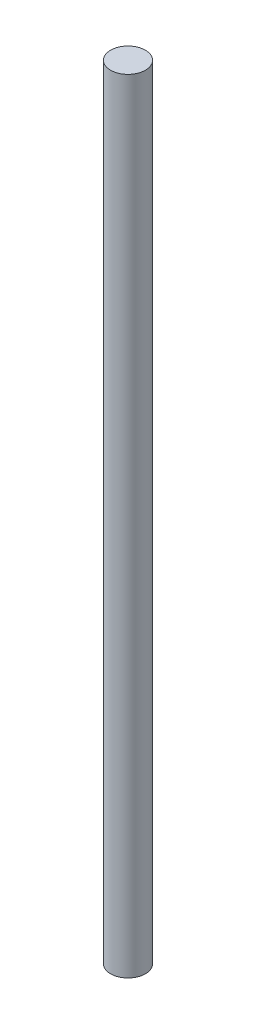
ISO-10303-21;
HEADER;
FILE_DESCRIPTION(('STEP AP214'),'2;1');
FILE_NAME('part.step','',(''),(''),'','','');
FILE_SCHEMA(('AUTOMOTIVE_DESIGN { 1 0 10303 214 1 1 1 1 }'));
ENDSEC;
DATA;
#1=APPLICATION_CONTEXT('core data for automotive mechanical design processes');
#2=APPLICATION_PROTOCOL_DEFINITION('international standard','automotive_design',2000,#1);
#3=PRODUCT_CONTEXT('',#1,'mechanical');
#4=PRODUCT('Part','Part','',(#3));
#5=PRODUCT_RELATED_PRODUCT_CATEGORY('part','',(#4));
#6=PRODUCT_DEFINITION_FORMATION('','',#4);
#7=PRODUCT_DEFINITION_CONTEXT('part definition',#1,'design');
#8=PRODUCT_DEFINITION('design','',#6,#7);
#9=PRODUCT_DEFINITION_SHAPE('','',#8);
#10=(LENGTH_UNIT() NAMED_UNIT(*) SI_UNIT(.MILLI.,.METRE.));
#11=(NAMED_UNIT(*) PLANE_ANGLE_UNIT() SI_UNIT($,.RADIAN.));
#12=(NAMED_UNIT(*) SI_UNIT($,.STERADIAN.) SOLID_ANGLE_UNIT());
#13=UNCERTAINTY_MEASURE_WITH_UNIT(LENGTH_MEASURE(1.E-05),#10,'distance_accuracy_value','');
#14=(GEOMETRIC_REPRESENTATION_CONTEXT(3) GLOBAL_UNCERTAINTY_ASSIGNED_CONTEXT((#13)) GLOBAL_UNIT_ASSIGNED_CONTEXT((#10,
#11,#12)) REPRESENTATION_CONTEXT('',''));
#15=CARTESIAN_POINT('',(0.,0.,0.));
#16=DIRECTION('',(0.,0.,1.));
#17=DIRECTION('',(1.,0.,0.));
#18=AXIS2_PLACEMENT_3D('',#15,#16,#17);
#19=CARTESIAN_POINT('',(0.,4.5,0.));
#20=DIRECTION('',(0.,-1.,0.));
#21=DIRECTION('',(0.,0.,-1.));
#22=AXIS2_PLACEMENT_3D('',#19,#20,#21);
#23=CYLINDRICAL_SURFACE('',#22,0.1);
#24=CARTESIAN_POINT('',(0.,4.5,0.));
#25=DIRECTION('',(0.,1.,0.));
#26=DIRECTION('',(0.,0.,1.));
#27=AXIS2_PLACEMENT_3D('',#24,#25,#26);
#28=CIRCLE('',#27,0.1);
#29=CARTESIAN_POINT('',(0.,4.5,0.1));
#30=VERTEX_POINT('',#29);
#31=EDGE_CURVE('E10',#30,#30,#28,.T.);
#32=ORIENTED_EDGE('',*,*,#31,.F.);
#33=EDGE_LOOP('',(#32));
#34=FACE_BOUND('',#33,.T.);
#35=CARTESIAN_POINT('',(0.,0.,0.));
#36=DIRECTION('',(0.,1.,0.));
#37=DIRECTION('',(0.,0.,1.));
#38=AXIS2_PLACEMENT_3D('',#35,#36,#37);
#39=CIRCLE('',#38,0.1);
#40=CARTESIAN_POINT('',(0.,0.,0.1));
#41=VERTEX_POINT('',#40);
#42=EDGE_CURVE('E36',#41,#41,#39,.T.);
#43=ORIENTED_EDGE('',*,*,#42,.T.);
#44=EDGE_LOOP('',(#43));
#45=FACE_BOUND('',#44,.T.);
#46=ADVANCED_FACE('F33',(#34,#45),#23,.T.);
#47=CARTESIAN_POINT('',(0.,4.5,0.));
#48=DIRECTION('',(0.,1.,0.));
#49=DIRECTION('',(0.,0.,1.));
#50=AXIS2_PLACEMENT_3D('',#47,#48,#49);
#51=PLANE('',#50);
#52=ORIENTED_EDGE('',*,*,#31,.T.);
#53=EDGE_LOOP('',(#52));
#54=FACE_BOUND('',#53,.T.);
#55=ADVANCED_FACE('F48',(#54),#51,.T.);
#56=CARTESIAN_POINT('',(0.,0.,0.));
#57=DIRECTION('',(0.,1.,0.));
#58=DIRECTION('',(0.,0.,1.));
#59=AXIS2_PLACEMENT_3D('',#56,#57,#58);
#60=PLANE('',#59);
#61=ORIENTED_EDGE('',*,*,#42,.F.);
#62=EDGE_LOOP('',(#61));
#63=FACE_BOUND('',#62,.T.);
#64=ADVANCED_FACE('F46',(#63),#60,.F.);
#65=CLOSED_SHELL('',(#46,#55,#64));
#66=MANIFOLD_SOLID_BREP('B2',#65);
#67=ADVANCED_BREP_SHAPE_REPRESENTATION('',(#18,#66),#14);
#68=SHAPE_DEFINITION_REPRESENTATION(#9,#67);
ENDSEC;
END-ISO-10303-21;
